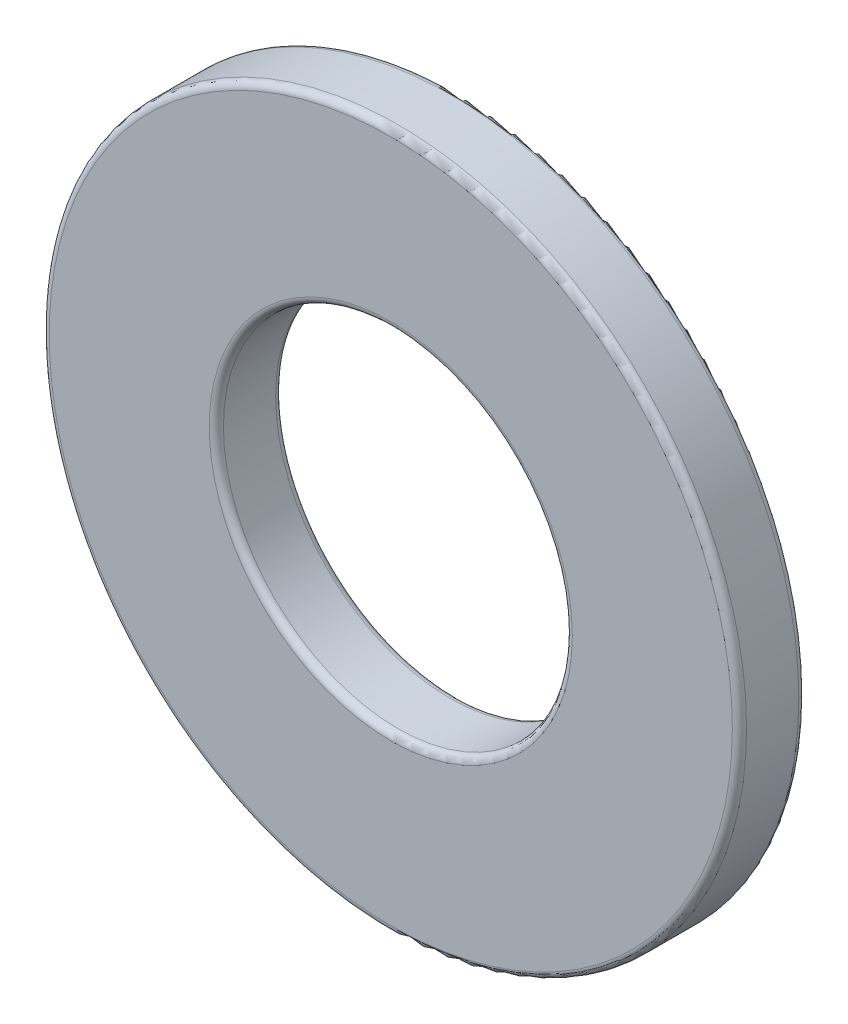
ISO-10303-21;
HEADER;
FILE_DESCRIPTION(('STEP AP214'),'2;1');
FILE_NAME('part.step','',(''),(''),'','','');
FILE_SCHEMA(('AUTOMOTIVE_DESIGN { 1 0 10303 214 1 1 1 1 }'));
ENDSEC;
DATA;
#1=APPLICATION_CONTEXT('core data for automotive mechanical design processes');
#2=APPLICATION_PROTOCOL_DEFINITION('international standard','automotive_design',2000,#1);
#3=PRODUCT_CONTEXT('',#1,'mechanical');
#4=PRODUCT('Part','Part','',(#3));
#5=PRODUCT_RELATED_PRODUCT_CATEGORY('part','',(#4));
#6=PRODUCT_DEFINITION_FORMATION('','',#4);
#7=PRODUCT_DEFINITION_CONTEXT('part definition',#1,'design');
#8=PRODUCT_DEFINITION('design','',#6,#7);
#9=PRODUCT_DEFINITION_SHAPE('','',#8);
#10=(LENGTH_UNIT() NAMED_UNIT(*) SI_UNIT(.MILLI.,.METRE.));
#11=(NAMED_UNIT(*) PLANE_ANGLE_UNIT() SI_UNIT($,.RADIAN.));
#12=(NAMED_UNIT(*) SI_UNIT($,.STERADIAN.) SOLID_ANGLE_UNIT());
#13=UNCERTAINTY_MEASURE_WITH_UNIT(LENGTH_MEASURE(1.E-05),#10,'distance_accuracy_value','');
#14=(GEOMETRIC_REPRESENTATION_CONTEXT(3) GLOBAL_UNCERTAINTY_ASSIGNED_CONTEXT((#13)) GLOBAL_UNIT_ASSIGNED_CONTEXT((#10,
#11,#12)) REPRESENTATION_CONTEXT('',''));
#15=CARTESIAN_POINT('',(0.,0.,0.));
#16=DIRECTION('',(0.,0.,1.));
#17=DIRECTION('',(1.,0.,0.));
#18=AXIS2_PLACEMENT_3D('',#15,#16,#17);
#19=CARTESIAN_POINT('',(0.,0.,0.83185));
#20=DIRECTION('',(0.,0.,1.));
#21=DIRECTION('',(1.,0.,0.));
#22=AXIS2_PLACEMENT_3D('',#19,#20,#21);
#23=PLANE('',#22);
#24=CARTESIAN_POINT('',(0.,0.,0.83185));
#25=DIRECTION('',(0.,0.,1.));
#26=DIRECTION('',(1.,0.,0.));
#27=AXIS2_PLACEMENT_3D('',#24,#25,#26);
#28=CIRCLE('',#27,4.5466);
#29=CARTESIAN_POINT('',(4.5466,0.,0.83185));
#30=VERTEX_POINT('',#29);
#31=EDGE_CURVE('E67',#30,#30,#28,.F.);
#32=ORIENTED_EDGE('',*,*,#31,.T.);
#33=EDGE_LOOP('',(#32));
#34=FACE_BOUND('',#33,.T.);
#35=CARTESIAN_POINT('',(0.,0.,0.83185));
#36=DIRECTION('',(0.,0.,1.));
#37=DIRECTION('',(1.,0.,0.));
#38=AXIS2_PLACEMENT_3D('',#35,#36,#37);
#39=CIRCLE('',#38,8.55345);
#40=CARTESIAN_POINT('',(8.55345,0.,0.83185));
#41=VERTEX_POINT('',#40);
#42=EDGE_CURVE('E71',#41,#41,#39,.T.);
#43=ORIENTED_EDGE('',*,*,#42,.T.);
#44=EDGE_LOOP('',(#43));
#45=FACE_BOUND('',#44,.T.);
#46=ADVANCED_FACE('F43',(#34,#45),#23,.T.);
#47=CARTESIAN_POINT('',(0.,0.,-0.83185));
#48=DIRECTION('',(0.,0.,1.));
#49=DIRECTION('',(1.,0.,0.));
#50=AXIS2_PLACEMENT_3D('',#47,#48,#49);
#51=PLANE('',#50);
#52=CARTESIAN_POINT('',(0.,0.,-0.83185));
#53=DIRECTION('',(0.,0.,1.));
#54=DIRECTION('',(1.,0.,0.));
#55=AXIS2_PLACEMENT_3D('',#52,#53,#54);
#56=CIRCLE('',#55,4.5466);
#57=CARTESIAN_POINT('',(4.5466,0.,-0.83185));
#58=VERTEX_POINT('',#57);
#59=EDGE_CURVE('E10',#58,#58,#56,.T.);
#60=ORIENTED_EDGE('',*,*,#59,.T.);
#61=EDGE_LOOP('',(#60));
#62=FACE_BOUND('',#61,.T.);
#63=CARTESIAN_POINT('',(0.,0.,-0.83185));
#64=DIRECTION('',(0.,0.,1.));
#65=DIRECTION('',(1.,0.,0.));
#66=AXIS2_PLACEMENT_3D('',#63,#64,#65);
#67=CIRCLE('',#66,8.55345);
#68=CARTESIAN_POINT('',(8.55345,0.,-0.83185));
#69=VERTEX_POINT('',#68);
#70=EDGE_CURVE('E51',#69,#69,#67,.F.);
#71=ORIENTED_EDGE('',*,*,#70,.T.);
#72=EDGE_LOOP('',(#71));
#73=FACE_BOUND('',#72,.T.);
#74=ADVANCED_FACE('F99',(#62,#73),#51,.F.);
#75=CARTESIAN_POINT('',(0.,0.,0.83185));
#76=DIRECTION('',(0.,0.,-1.));
#77=DIRECTION('',(-1.,0.,0.));
#78=AXIS2_PLACEMENT_3D('',#75,#76,#77);
#79=CYLINDRICAL_SURFACE('',#78,8.73125);
#80=CARTESIAN_POINT('',(0.,0.,0.65405));
#81=DIRECTION('',(0.,0.,1.));
#82=DIRECTION('',(1.,0.,0.));
#83=AXIS2_PLACEMENT_3D('',#80,#81,#82);
#84=CIRCLE('',#83,8.73125);
#85=CARTESIAN_POINT('',(8.73125,0.,0.65405));
#86=VERTEX_POINT('',#85);
#87=EDGE_CURVE('E56',#86,#86,#84,.F.);
#88=ORIENTED_EDGE('',*,*,#87,.T.);
#89=EDGE_LOOP('',(#88));
#90=FACE_BOUND('',#89,.T.);
#91=CARTESIAN_POINT('',(0.,0.,-0.65405));
#92=DIRECTION('',(0.,0.,1.));
#93=DIRECTION('',(1.,0.,0.));
#94=AXIS2_PLACEMENT_3D('',#91,#92,#93);
#95=CIRCLE('',#94,8.73125);
#96=CARTESIAN_POINT('',(8.73125,0.,-0.65405));
#97=VERTEX_POINT('',#96);
#98=EDGE_CURVE('E61',#97,#97,#95,.T.);
#99=ORIENTED_EDGE('',*,*,#98,.T.);
#100=EDGE_LOOP('',(#99));
#101=FACE_BOUND('',#100,.T.);
#102=ADVANCED_FACE('F105',(#90,#101),#79,.T.);
#103=CARTESIAN_POINT('',(0.,0.,0.83185));
#104=DIRECTION('',(0.,0.,-1.));
#105=DIRECTION('',(-1.,0.,0.));
#106=AXIS2_PLACEMENT_3D('',#103,#104,#105);
#107=CYLINDRICAL_SURFACE('',#106,4.3688);
#108=CARTESIAN_POINT('',(0.,0.,0.65405));
#109=DIRECTION('',(0.,0.,1.));
#110=DIRECTION('',(1.,0.,0.));
#111=AXIS2_PLACEMENT_3D('',#108,#109,#110);
#112=CIRCLE('',#111,4.3688);
#113=CARTESIAN_POINT('',(4.3688,0.,0.65405));
#114=VERTEX_POINT('',#113);
#115=EDGE_CURVE('E75',#114,#114,#112,.T.);
#116=ORIENTED_EDGE('',*,*,#115,.T.);
#117=EDGE_LOOP('',(#116));
#118=FACE_BOUND('',#117,.T.);
#119=CARTESIAN_POINT('',(0.,0.,-0.65405));
#120=DIRECTION('',(0.,0.,1.));
#121=DIRECTION('',(1.,0.,0.));
#122=AXIS2_PLACEMENT_3D('',#119,#120,#121);
#123=CIRCLE('',#122,4.3688);
#124=CARTESIAN_POINT('',(4.3688,0.,-0.65405));
#125=VERTEX_POINT('',#124);
#126=EDGE_CURVE('E79',#125,#125,#123,.F.);
#127=ORIENTED_EDGE('',*,*,#126,.T.);
#128=EDGE_LOOP('',(#127));
#129=FACE_BOUND('',#128,.T.);
#130=ADVANCED_FACE('F84',(#118,#129),#107,.F.);
#131=CARTESIAN_POINT('',(0.,0.,0.65405));
#132=DIRECTION('',(0.,0.,1.));
#133=DIRECTION('',(1.,0.,0.));
#134=AXIS2_PLACEMENT_3D('',#131,#132,#133);
#135=TOROIDAL_SURFACE('',#134,4.5466,0.1778);
#136=ORIENTED_EDGE('',*,*,#31,.F.);
#137=EDGE_LOOP('',(#136));
#138=FACE_BOUND('',#137,.T.);
#139=ORIENTED_EDGE('',*,*,#115,.F.);
#140=EDGE_LOOP('',(#139));
#141=FACE_BOUND('',#140,.T.);
#142=ADVANCED_FACE('F95',(#138,#141),#135,.T.);
#143=CARTESIAN_POINT('',(0.,0.,0.65405));
#144=DIRECTION('',(0.,0.,1.));
#145=DIRECTION('',(1.,0.,0.));
#146=AXIS2_PLACEMENT_3D('',#143,#144,#145);
#147=TOROIDAL_SURFACE('',#146,8.55345,0.1778);
#148=ORIENTED_EDGE('',*,*,#87,.F.);
#149=EDGE_LOOP('',(#148));
#150=FACE_BOUND('',#149,.T.);
#151=ORIENTED_EDGE('',*,*,#42,.F.);
#152=EDGE_LOOP('',(#151));
#153=FACE_BOUND('',#152,.T.);
#154=ADVANCED_FACE('F89',(#150,#153),#147,.T.);
#155=CARTESIAN_POINT('',(0.,0.,-0.65405));
#156=DIRECTION('',(0.,0.,1.));
#157=DIRECTION('',(1.,0.,0.));
#158=AXIS2_PLACEMENT_3D('',#155,#156,#157);
#159=TOROIDAL_SURFACE('',#158,4.5466,0.1778);
#160=ORIENTED_EDGE('',*,*,#126,.F.);
#161=EDGE_LOOP('',(#160));
#162=FACE_BOUND('',#161,.T.);
#163=ORIENTED_EDGE('',*,*,#59,.F.);
#164=EDGE_LOOP('',(#163));
#165=FACE_BOUND('',#164,.T.);
#166=ADVANCED_FACE('F86',(#162,#165),#159,.T.);
#167=CARTESIAN_POINT('',(0.,0.,-0.65405));
#168=DIRECTION('',(0.,0.,1.));
#169=DIRECTION('',(1.,0.,0.));
#170=AXIS2_PLACEMENT_3D('',#167,#168,#169);
#171=TOROIDAL_SURFACE('',#170,8.55345,0.1778);
#172=ORIENTED_EDGE('',*,*,#70,.F.);
#173=EDGE_LOOP('',(#172));
#174=FACE_BOUND('',#173,.T.);
#175=ORIENTED_EDGE('',*,*,#98,.F.);
#176=EDGE_LOOP('',(#175));
#177=FACE_BOUND('',#176,.T.);
#178=ADVANCED_FACE('F45',(#174,#177),#171,.T.);
#179=CLOSED_SHELL('',(#46,#74,#102,#130,#142,#154,#166,#178));
#180=MANIFOLD_SOLID_BREP('B2',#179);
#181=ADVANCED_BREP_SHAPE_REPRESENTATION('',(#18,#180),#14);
#182=SHAPE_DEFINITION_REPRESENTATION(#9,#181);
ENDSEC;
END-ISO-10303-21;
